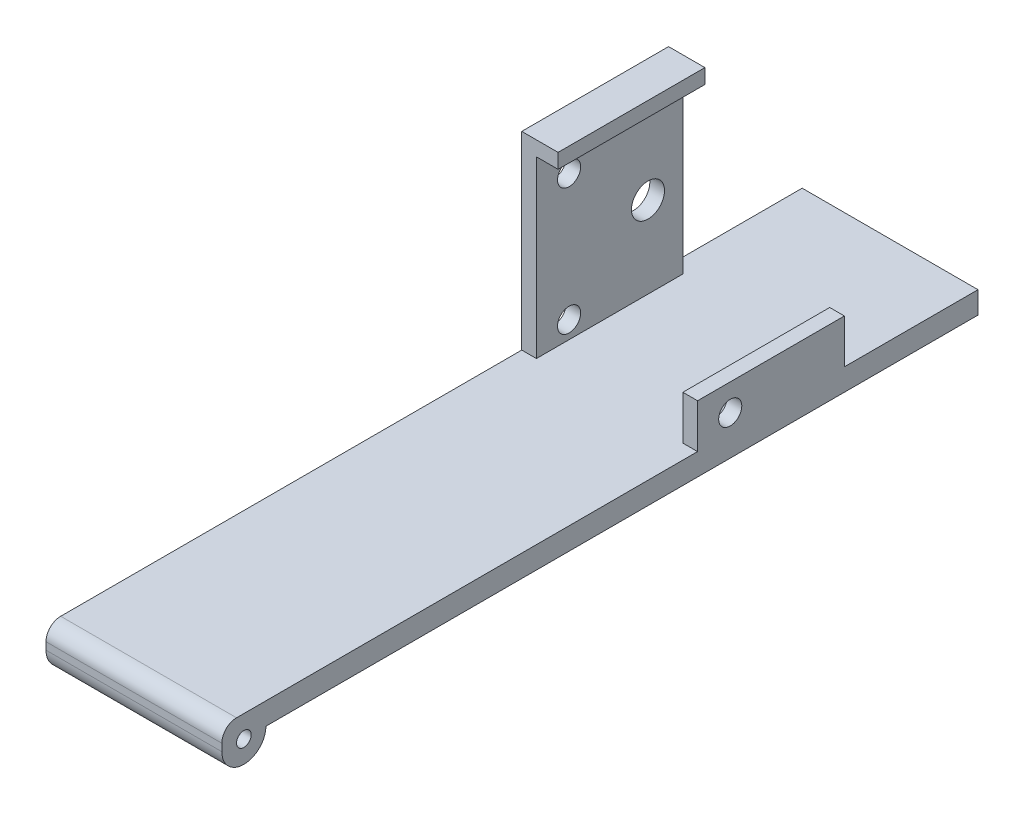
ISO-10303-21;
HEADER;
FILE_DESCRIPTION(('STEP AP214'),'2;1');
FILE_NAME('part.step','',(''),(''),'','','');
FILE_SCHEMA(('AUTOMOTIVE_DESIGN { 1 0 10303 214 1 1 1 1 }'));
ENDSEC;
DATA;
#1=APPLICATION_CONTEXT('core data for automotive mechanical design processes');
#2=APPLICATION_PROTOCOL_DEFINITION('international standard','automotive_design',2000,#1);
#3=PRODUCT_CONTEXT('',#1,'mechanical');
#4=PRODUCT('Part','Part','',(#3));
#5=PRODUCT_RELATED_PRODUCT_CATEGORY('part','',(#4));
#6=PRODUCT_DEFINITION_FORMATION('','',#4);
#7=PRODUCT_DEFINITION_CONTEXT('part definition',#1,'design');
#8=PRODUCT_DEFINITION('design','',#6,#7);
#9=PRODUCT_DEFINITION_SHAPE('','',#8);
#10=(LENGTH_UNIT() NAMED_UNIT(*) SI_UNIT(.MILLI.,.METRE.));
#11=(NAMED_UNIT(*) PLANE_ANGLE_UNIT() SI_UNIT($,.RADIAN.));
#12=(NAMED_UNIT(*) SI_UNIT($,.STERADIAN.) SOLID_ANGLE_UNIT());
#13=UNCERTAINTY_MEASURE_WITH_UNIT(LENGTH_MEASURE(1.E-05),#10,'distance_accuracy_value','');
#14=(GEOMETRIC_REPRESENTATION_CONTEXT(3) GLOBAL_UNCERTAINTY_ASSIGNED_CONTEXT((#13)) GLOBAL_UNIT_ASSIGNED_CONTEXT((#10,
#11,#12)) REPRESENTATION_CONTEXT('',''));
#15=CARTESIAN_POINT('',(0.,0.,0.));
#16=DIRECTION('',(0.,0.,1.));
#17=DIRECTION('',(1.,0.,0.));
#18=AXIS2_PLACEMENT_3D('',#15,#16,#17);
#19=CARTESIAN_POINT('',(9.975,25.7330481366075,-3.56846330647235));
#20=DIRECTION('',(0.,0.,-1.));
#21=DIRECTION('',(0.,1.,0.));
#22=AXIS2_PLACEMENT_3D('',#19,#20,#21);
#23=PLANE('',#22);
#24=DIRECTION('',(1.,0.,0.));
#25=VECTOR('',#24,1.);
#26=CARTESIAN_POINT('',(-7.025,7.93304813660745,-3.56846330647235));
#27=LINE('',#26,#25);
#28=CARTESIAN_POINT('',(9.975,7.93304813660745,-3.56846330647235));
#29=VERTEX_POINT('',#28);
#30=CARTESIAN_POINT('',(11.975,7.93304813660745,-3.56846330647235));
#31=VERTEX_POINT('',#30);
#32=EDGE_CURVE('E48',#29,#31,#27,.T.);
#33=ORIENTED_EDGE('',*,*,#32,.T.);
#34=DIRECTION('',(0.,1.,0.));
#35=VECTOR('',#34,1.);
#36=CARTESIAN_POINT('',(11.975,25.7330481366075,-3.56846330647235));
#37=LINE('',#36,#35);
#38=CARTESIAN_POINT('',(11.975,1.93304813660745,-3.56846330647235));
#39=VERTEX_POINT('',#38);
#40=EDGE_CURVE('E226',#39,#31,#37,.T.);
#41=ORIENTED_EDGE('',*,*,#40,.F.);
#42=DIRECTION('',(1.,0.,0.));
#43=VECTOR('',#42,1.);
#44=CARTESIAN_POINT('',(9.975,1.93304813660745,-3.56846330647235));
#45=LINE('',#44,#43);
#46=CARTESIAN_POINT('',(9.975,1.93304813660745,-3.56846330647235));
#47=VERTEX_POINT('',#46);
#48=EDGE_CURVE('E236',#47,#39,#45,.T.);
#49=ORIENTED_EDGE('',*,*,#48,.F.);
#50=DIRECTION('',(0.,1.,0.));
#51=VECTOR('',#50,1.);
#52=CARTESIAN_POINT('',(9.975,25.7330481366075,-3.56846330647235));
#53=LINE('',#52,#51);
#54=EDGE_CURVE('E229',#47,#29,#53,.T.);
#55=ORIENTED_EDGE('',*,*,#54,.T.);
#56=EDGE_LOOP('',(#33,#41,#49,#55));
#57=FACE_BOUND('',#56,.T.);
#58=ADVANCED_FACE('F33',(#57),#23,.T.);
#59=CARTESIAN_POINT('',(9.975,25.7330481366075,16.4315366935277));
#60=DIRECTION('',(0.,0.,1.));
#61=DIRECTION('',(1.,0.,0.));
#62=AXIS2_PLACEMENT_3D('',#59,#60,#61);
#63=PLANE('',#62);
#64=DIRECTION('',(1.,0.,0.));
#65=VECTOR('',#64,1.);
#66=CARTESIAN_POINT('',(-7.025,7.93304813660745,16.4315366935276));
#67=LINE('',#66,#65);
#68=CARTESIAN_POINT('',(9.975,7.93304813660745,16.4315366935276));
#69=VERTEX_POINT('',#68);
#70=CARTESIAN_POINT('',(11.975,7.93304813660745,16.4315366935276));
#71=VERTEX_POINT('',#70);
#72=EDGE_CURVE('E150',#69,#71,#67,.T.);
#73=ORIENTED_EDGE('',*,*,#72,.F.);
#74=DIRECTION('',(0.,-1.,0.));
#75=VECTOR('',#74,1.);
#76=CARTESIAN_POINT('',(9.975,25.7330481366075,16.4315366935277));
#77=LINE('',#76,#75);
#78=CARTESIAN_POINT('',(9.975,1.93304813660745,16.4315366935277));
#79=VERTEX_POINT('',#78);
#80=EDGE_CURVE('E223',#69,#79,#77,.T.);
#81=ORIENTED_EDGE('',*,*,#80,.T.);
#82=DIRECTION('',(1.,0.,0.));
#83=VECTOR('',#82,1.);
#84=CARTESIAN_POINT('',(9.975,1.93304813660745,16.4315366935277));
#85=LINE('',#84,#83);
#86=CARTESIAN_POINT('',(11.975,1.93304813660745,16.4315366935276));
#87=VERTEX_POINT('',#86);
#88=EDGE_CURVE('E232',#79,#87,#85,.T.);
#89=ORIENTED_EDGE('',*,*,#88,.T.);
#90=DIRECTION('',(0.,-1.,0.));
#91=VECTOR('',#90,1.);
#92=CARTESIAN_POINT('',(11.975,25.7330481366075,16.4315366935277));
#93=LINE('',#92,#91);
#94=EDGE_CURVE('E220',#71,#87,#93,.T.);
#95=ORIENTED_EDGE('',*,*,#94,.F.);
#96=EDGE_LOOP('',(#73,#81,#89,#95));
#97=FACE_BOUND('',#96,.T.);
#98=ADVANCED_FACE('F336',(#97),#63,.T.);
#99=CARTESIAN_POINT('',(11.975,1.93304813660745,-21.7682226541538));
#100=DIRECTION('',(0.,-1.,0.));
#101=DIRECTION('',(0.,0.,-1.));
#102=AXIS2_PLACEMENT_3D('',#99,#100,#101);
#103=PLANE('',#102);
#104=DIRECTION('',(-1.,0.,0.));
#105=VECTOR('',#104,1.);
#106=CARTESIAN_POINT('',(-9.975,1.93304813660745,16.4315366935277));
#107=LINE('',#106,#105);
#108=CARTESIAN_POINT('',(-9.975,1.93304813660745,16.4315366935276));
#109=VERTEX_POINT('',#108);
#110=CARTESIAN_POINT('',(-11.975,1.93304813660745,16.4315366935276));
#111=VERTEX_POINT('',#110);
#112=EDGE_CURVE('E212',#109,#111,#107,.T.);
#113=ORIENTED_EDGE('',*,*,#112,.T.);
#114=DIRECTION('',(0.,0.,1.));
#115=VECTOR('',#114,1.);
#116=CARTESIAN_POINT('',(-11.975,1.93304813660745,-21.7682226541538));
#117=LINE('',#116,#115);
#118=CARTESIAN_POINT('',(-11.975,1.93304813660744,79.2317773458462));
#119=VERTEX_POINT('',#118);
#120=EDGE_CURVE('E267',#111,#119,#117,.T.);
#121=ORIENTED_EDGE('',*,*,#120,.T.);
#122=DIRECTION('',(-1.,0.,0.));
#123=VECTOR('',#122,1.);
#124=CARTESIAN_POINT('',(11.975,1.93304813660744,79.2317773458462));
#125=LINE('',#124,#123);
#126=CARTESIAN_POINT('',(11.975,1.93304813660744,79.2317773458462));
#127=VERTEX_POINT('',#126);
#128=EDGE_CURVE('E288',#127,#119,#125,.T.);
#129=ORIENTED_EDGE('',*,*,#128,.F.);
#130=DIRECTION('',(0.,0.,1.));
#131=VECTOR('',#130,1.);
#132=CARTESIAN_POINT('',(11.975,1.93304813660745,-21.7682226541538));
#133=LINE('',#132,#131);
#134=EDGE_CURVE('E251',#87,#127,#133,.T.);
#135=ORIENTED_EDGE('',*,*,#134,.F.);
#136=ORIENTED_EDGE('',*,*,#88,.F.);
#137=DIRECTION('',(0.,0.,-1.));
#138=VECTOR('',#137,1.);
#139=CARTESIAN_POINT('',(9.975,1.93304813660745,16.4315366935277));
#140=LINE('',#139,#138);
#141=EDGE_CURVE('E225',#79,#47,#140,.T.);
#142=ORIENTED_EDGE('',*,*,#141,.T.);
#143=ORIENTED_EDGE('',*,*,#48,.T.);
#144=CARTESIAN_POINT('',(11.975,1.93304813660745,-21.7682226541538));
#145=VERTEX_POINT('',#144);
#146=EDGE_CURVE('E253',#145,#39,#133,.T.);
#147=ORIENTED_EDGE('',*,*,#146,.F.);
#148=DIRECTION('',(-1.,0.,0.));
#149=VECTOR('',#148,1.);
#150=CARTESIAN_POINT('',(11.975,1.93304813660745,-21.7682226541538));
#151=LINE('',#150,#149);
#152=CARTESIAN_POINT('',(-11.975,1.93304813660745,-21.7682226541538));
#153=VERTEX_POINT('',#152);
#154=EDGE_CURVE('E41',#145,#153,#151,.T.);
#155=ORIENTED_EDGE('',*,*,#154,.T.);
#156=CARTESIAN_POINT('',(-11.975,1.93304813660745,-3.56846330647235));
#157=VERTEX_POINT('',#156);
#158=EDGE_CURVE('E268',#153,#157,#117,.T.);
#159=ORIENTED_EDGE('',*,*,#158,.T.);
#160=DIRECTION('',(-1.,0.,0.));
#161=VECTOR('',#160,1.);
#162=CARTESIAN_POINT('',(-9.975,1.93304813660745,-3.56846330647235));
#163=LINE('',#162,#161);
#164=CARTESIAN_POINT('',(-9.975,1.93304813660745,-3.56846330647235));
#165=VERTEX_POINT('',#164);
#166=EDGE_CURVE('E208',#165,#157,#163,.T.);
#167=ORIENTED_EDGE('',*,*,#166,.F.);
#168=DIRECTION('',(0.,0.,-1.));
#169=VECTOR('',#168,1.);
#170=CARTESIAN_POINT('',(-9.975,1.93304813660745,16.4315366935277));
#171=LINE('',#170,#169);
#172=EDGE_CURVE('E202',#109,#165,#171,.T.);
#173=ORIENTED_EDGE('',*,*,#172,.F.);
#174=EDGE_LOOP('',(#113,#121,#129,#135,#136,#142,#143,#147,#155,#159,#167,#173));
#175=FACE_BOUND('',#174,.T.);
#176=ADVANCED_FACE('F293',(#175),#103,.F.);
#177=CARTESIAN_POINT('',(11.975,-1.06695186339256,78.2317773458462));
#178=DIRECTION('',(1.,0.,0.));
#179=DIRECTION('',(0.,0.,-1.));
#180=AXIS2_PLACEMENT_3D('',#177,#178,#179);
#181=PLANE('',#180);
#182=DIRECTION('',(0.,0.,-1.));
#183=VECTOR('',#182,1.);
#184=CARTESIAN_POINT('',(11.975,7.93304813660745,16.4315366935276));
#185=LINE('',#184,#183);
#186=EDGE_CURVE('E161',#71,#31,#185,.T.);
#187=ORIENTED_EDGE('',*,*,#186,.F.);
#188=ORIENTED_EDGE('',*,*,#94,.T.);
#189=ORIENTED_EDGE('',*,*,#134,.T.);
#190=CARTESIAN_POINT('',(11.975,-0.0669518633925606,79.2317773458462));
#191=DIRECTION('',(1.,0.,0.));
#192=DIRECTION('',(0.,0.,-1.));
#193=AXIS2_PLACEMENT_3D('',#190,#191,#192);
#194=CIRCLE('',#193,2.);
#195=CARTESIAN_POINT('',(11.975,-0.0669518633925603,81.2317773458462));
#196=VERTEX_POINT('',#195);
#197=EDGE_CURVE('E256',#127,#196,#194,.T.);
#198=ORIENTED_EDGE('',*,*,#197,.T.);
#199=DIRECTION('',(0.,-1.,0.));
#200=VECTOR('',#199,1.);
#201=CARTESIAN_POINT('',(11.975,-0.0669518633925608,81.2317773458462));
#202=LINE('',#201,#200);
#203=CARTESIAN_POINT('',(11.975,-1.06695186339256,81.2317773458462));
#204=VERTEX_POINT('',#203);
#205=EDGE_CURVE('E258',#196,#204,#202,.T.);
#206=ORIENTED_EDGE('',*,*,#205,.T.);
#207=CARTESIAN_POINT('',(11.975,-1.06695186339256,78.2317773458462));
#208=DIRECTION('',(1.,0.,0.));
#209=DIRECTION('',(0.,0.,-1.));
#210=AXIS2_PLACEMENT_3D('',#207,#208,#209);
#211=CIRCLE('',#210,3.);
#212=CARTESIAN_POINT('',(11.975,-1.06695186339256,75.2317773458462));
#213=VERTEX_POINT('',#212);
#214=EDGE_CURVE('E260',#204,#213,#211,.T.);
#215=ORIENTED_EDGE('',*,*,#214,.T.);
#216=DIRECTION('',(0.,0.,-1.));
#217=VECTOR('',#216,1.);
#218=CARTESIAN_POINT('',(11.975,-1.06695186339255,-21.7682226541538));
#219=LINE('',#218,#217);
#220=CARTESIAN_POINT('',(11.975,-1.06695186339255,-21.7682226541538));
#221=VERTEX_POINT('',#220);
#222=EDGE_CURVE('E262',#213,#221,#219,.T.);
#223=ORIENTED_EDGE('',*,*,#222,.T.);
#224=DIRECTION('',(0.,1.,0.));
#225=VECTOR('',#224,1.);
#226=CARTESIAN_POINT('',(11.975,1.93304813660745,-21.7682226541538));
#227=LINE('',#226,#225);
#228=EDGE_CURVE('E248',#221,#145,#227,.T.);
#229=ORIENTED_EDGE('',*,*,#228,.T.);
#230=ORIENTED_EDGE('',*,*,#146,.T.);
#231=ORIENTED_EDGE('',*,*,#40,.T.);
#232=EDGE_LOOP('',(#187,#188,#189,#198,#206,#215,#223,#229,#230,#231));
#233=FACE_BOUND('',#232,.T.);
#234=CARTESIAN_POINT('',(11.975,-1.06695186339256,78.2317773458462));
#235=DIRECTION('',(1.,0.,0.));
#236=DIRECTION('',(0.,0.,-1.));
#237=AXIS2_PLACEMENT_3D('',#234,#235,#236);
#238=CIRCLE('',#237,0.999999999999998);
#239=CARTESIAN_POINT('',(11.975,-1.06695186339256,77.2317773458462));
#240=VERTEX_POINT('',#239);
#241=EDGE_CURVE('E242',#240,#240,#238,.T.);
#242=ORIENTED_EDGE('',*,*,#241,.F.);
#243=EDGE_LOOP('',(#242));
#244=FACE_BOUND('',#243,.T.);
#245=CARTESIAN_POINT('',(11.975,4.30804813660745,11.9815366935276));
#246=DIRECTION('',(1.,0.,0.));
#247=DIRECTION('',(0.,0.,-1.));
#248=AXIS2_PLACEMENT_3D('',#245,#246,#247);
#249=CIRCLE('',#248,1.57500000000001);
#250=CARTESIAN_POINT('',(11.975,4.30804813660745,10.4065366935276));
#251=VERTEX_POINT('',#250);
#252=EDGE_CURVE('E214',#251,#251,#249,.T.);
#253=ORIENTED_EDGE('',*,*,#252,.F.);
#254=EDGE_LOOP('',(#253));
#255=FACE_BOUND('',#254,.T.);
#256=ADVANCED_FACE('F327',(#233,#244,#255),#181,.T.);
#257=CARTESIAN_POINT('',(-11.975,-1.06695186339256,78.2317773458462));
#258=DIRECTION('',(1.,0.,0.));
#259=DIRECTION('',(0.,0.,-1.));
#260=AXIS2_PLACEMENT_3D('',#257,#258,#259);
#261=PLANE('',#260);
#262=DIRECTION('',(0.,1.,0.));
#263=VECTOR('',#262,1.);
#264=CARTESIAN_POINT('',(-11.975,1.93304813660745,-21.7682226541538));
#265=LINE('',#264,#263);
#266=CARTESIAN_POINT('',(-11.975,-1.06695186339255,-21.7682226541538));
#267=VERTEX_POINT('',#266);
#268=EDGE_CURVE('E245',#267,#153,#265,.T.);
#269=ORIENTED_EDGE('',*,*,#268,.F.);
#270=DIRECTION('',(0.,0.,-1.));
#271=VECTOR('',#270,1.);
#272=CARTESIAN_POINT('',(-11.975,-1.06695186339255,-21.7682226541538));
#273=LINE('',#272,#271);
#274=CARTESIAN_POINT('',(-11.975,-1.06695186339256,75.2317773458462));
#275=VERTEX_POINT('',#274);
#276=EDGE_CURVE('E252',#275,#267,#273,.T.);
#277=ORIENTED_EDGE('',*,*,#276,.F.);
#278=CARTESIAN_POINT('',(-11.975,-1.06695186339256,78.2317773458462));
#279=DIRECTION('',(1.,0.,0.));
#280=DIRECTION('',(0.,0.,-1.));
#281=AXIS2_PLACEMENT_3D('',#278,#279,#280);
#282=CIRCLE('',#281,3.);
#283=CARTESIAN_POINT('',(-11.975,-1.06695186339256,81.2317773458462));
#284=VERTEX_POINT('',#283);
#285=EDGE_CURVE('E274',#284,#275,#282,.T.);
#286=ORIENTED_EDGE('',*,*,#285,.F.);
#287=DIRECTION('',(0.,-1.,0.));
#288=VECTOR('',#287,1.);
#289=CARTESIAN_POINT('',(-11.975,-0.0669518633925608,81.2317773458462));
#290=LINE('',#289,#288);
#291=CARTESIAN_POINT('',(-11.975,-0.0669518633925603,81.2317773458462));
#292=VERTEX_POINT('',#291);
#293=EDGE_CURVE('E272',#292,#284,#290,.T.);
#294=ORIENTED_EDGE('',*,*,#293,.F.);
#295=CARTESIAN_POINT('',(-11.975,-0.0669518633925606,79.2317773458462));
#296=DIRECTION('',(1.,0.,0.));
#297=DIRECTION('',(0.,0.,-1.));
#298=AXIS2_PLACEMENT_3D('',#295,#296,#297);
#299=CIRCLE('',#298,2.);
#300=EDGE_CURVE('E270',#119,#292,#299,.T.);
#301=ORIENTED_EDGE('',*,*,#300,.F.);
#302=ORIENTED_EDGE('',*,*,#120,.F.);
#303=DIRECTION('',(0.,-1.,0.));
#304=VECTOR('',#303,1.);
#305=CARTESIAN_POINT('',(-11.975,25.7330481366075,16.4315366935277));
#306=LINE('',#305,#304);
#307=CARTESIAN_POINT('',(-11.975,27.7330481366075,16.4315366935276));
#308=VERTEX_POINT('',#307);
#309=EDGE_CURVE('E199',#308,#111,#306,.T.);
#310=ORIENTED_EDGE('',*,*,#309,.F.);
#311=DIRECTION('',(0.,0.,1.));
#312=VECTOR('',#311,1.);
#313=CARTESIAN_POINT('',(-11.975,27.7330481366075,-3.56846330647235));
#314=LINE('',#313,#312);
#315=CARTESIAN_POINT('',(-11.975,27.7330481366075,-3.56846330647235));
#316=VERTEX_POINT('',#315);
#317=EDGE_CURVE('E165',#316,#308,#314,.T.);
#318=ORIENTED_EDGE('',*,*,#317,.F.);
#319=DIRECTION('',(0.,1.,0.));
#320=VECTOR('',#319,1.);
#321=CARTESIAN_POINT('',(-11.975,25.7330481366075,-3.56846330647235));
#322=LINE('',#321,#320);
#323=EDGE_CURVE('E192',#157,#316,#322,.T.);
#324=ORIENTED_EDGE('',*,*,#323,.F.);
#325=ORIENTED_EDGE('',*,*,#158,.F.);
#326=EDGE_LOOP('',(#269,#277,#286,#294,#301,#302,#310,#318,#324,#325));
#327=FACE_BOUND('',#326,.T.);
#328=CARTESIAN_POINT('',(-11.975,-1.06695186339256,78.2317773458462));
#329=DIRECTION('',(1.,0.,0.));
#330=DIRECTION('',(0.,0.,-1.));
#331=AXIS2_PLACEMENT_3D('',#328,#329,#330);
#332=CIRCLE('',#331,0.999999999999998);
#333=CARTESIAN_POINT('',(-11.975,-1.06695186339256,77.2317773458462));
#334=VERTEX_POINT('',#333);
#335=EDGE_CURVE('E239',#334,#334,#332,.T.);
#336=ORIENTED_EDGE('',*,*,#335,.T.);
#337=EDGE_LOOP('',(#336));
#338=FACE_BOUND('',#337,.T.);
#339=CARTESIAN_POINT('',(-11.975,21.5580481366075,11.9815366935276));
#340=DIRECTION('',(1.,0.,0.));
#341=DIRECTION('',(0.,0.,-1.));
#342=AXIS2_PLACEMENT_3D('',#339,#340,#341);
#343=CIRCLE('',#342,1.575);
#344=CARTESIAN_POINT('',(-11.975,21.5580481366075,10.4065366935276));
#345=VERTEX_POINT('',#344);
#346=EDGE_CURVE('E180',#345,#345,#343,.T.);
#347=ORIENTED_EDGE('',*,*,#346,.T.);
#348=EDGE_LOOP('',(#347));
#349=FACE_BOUND('',#348,.T.);
#350=CARTESIAN_POINT('',(-11.975,4.30804813660745,11.9815366935276));
#351=DIRECTION('',(1.,0.,0.));
#352=DIRECTION('',(0.,0.,-1.));
#353=AXIS2_PLACEMENT_3D('',#350,#351,#352);
#354=CIRCLE('',#353,1.57500000000001);
#355=CARTESIAN_POINT('',(-11.975,4.30804813660745,10.4065366935276));
#356=VERTEX_POINT('',#355);
#357=EDGE_CURVE('E186',#356,#356,#354,.T.);
#358=ORIENTED_EDGE('',*,*,#357,.T.);
#359=EDGE_LOOP('',(#358));
#360=FACE_BOUND('',#359,.T.);
#361=CARTESIAN_POINT('',(-11.975,13.0330481366075,1.23153669352761));
#362=DIRECTION('',(1.,0.,0.));
#363=DIRECTION('',(0.,0.,-1.));
#364=AXIS2_PLACEMENT_3D('',#361,#362,#363);
#365=CIRCLE('',#364,2.25);
#366=CARTESIAN_POINT('',(-11.975,13.0330481366075,-1.01846330647239));
#367=VERTEX_POINT('',#366);
#368=EDGE_CURVE('E168',#367,#367,#365,.T.);
#369=ORIENTED_EDGE('',*,*,#368,.T.);
#370=EDGE_LOOP('',(#369));
#371=FACE_BOUND('',#370,.T.);
#372=ADVANCED_FACE('F300',(#327,#338,#349,#360,#371),#261,.F.);
#373=CARTESIAN_POINT('',(11.975,1.93304813660745,-21.7682226541538));
#374=DIRECTION('',(0.,0.,1.));
#375=DIRECTION('',(1.,0.,0.));
#376=AXIS2_PLACEMENT_3D('',#373,#374,#375);
#377=PLANE('',#376);
#378=ORIENTED_EDGE('',*,*,#268,.T.);
#379=ORIENTED_EDGE('',*,*,#154,.F.);
#380=ORIENTED_EDGE('',*,*,#228,.F.);
#381=DIRECTION('',(-1.,0.,0.));
#382=VECTOR('',#381,1.);
#383=CARTESIAN_POINT('',(11.975,-1.06695186339255,-21.7682226541538));
#384=LINE('',#383,#382);
#385=EDGE_CURVE('E264',#221,#267,#384,.T.);
#386=ORIENTED_EDGE('',*,*,#385,.T.);
#387=EDGE_LOOP('',(#378,#379,#380,#386));
#388=FACE_BOUND('',#387,.T.);
#389=ADVANCED_FACE('F35',(#388),#377,.F.);
#390=CARTESIAN_POINT('',(11.975,-0.0669518633925606,79.2317773458462));
#391=DIRECTION('',(-1.,0.,0.));
#392=DIRECTION('',(0.,0.,1.));
#393=AXIS2_PLACEMENT_3D('',#390,#391,#392);
#394=CYLINDRICAL_SURFACE('',#393,2.);
#395=ORIENTED_EDGE('',*,*,#300,.T.);
#396=DIRECTION('',(-1.,0.,0.));
#397=VECTOR('',#396,1.);
#398=CARTESIAN_POINT('',(11.975,-0.0669518633925603,81.2317773458462));
#399=LINE('',#398,#397);
#400=EDGE_CURVE('E285',#196,#292,#399,.T.);
#401=ORIENTED_EDGE('',*,*,#400,.F.);
#402=ORIENTED_EDGE('',*,*,#197,.F.);
#403=ORIENTED_EDGE('',*,*,#128,.T.);
#404=EDGE_LOOP('',(#395,#401,#402,#403));
#405=FACE_BOUND('',#404,.T.);
#406=ADVANCED_FACE('F318',(#405),#394,.T.);
#407=CARTESIAN_POINT('',(11.975,-0.0669518633925608,81.2317773458462));
#408=DIRECTION('',(0.,0.,-1.));
#409=DIRECTION('',(-1.,0.,0.));
#410=AXIS2_PLACEMENT_3D('',#407,#408,#409);
#411=PLANE('',#410);
#412=ORIENTED_EDGE('',*,*,#293,.T.);
#413=DIRECTION('',(-1.,0.,0.));
#414=VECTOR('',#413,1.);
#415=CARTESIAN_POINT('',(11.975,-1.06695186339256,81.2317773458462));
#416=LINE('',#415,#414);
#417=EDGE_CURVE('E282',#204,#284,#416,.T.);
#418=ORIENTED_EDGE('',*,*,#417,.F.);
#419=ORIENTED_EDGE('',*,*,#205,.F.);
#420=ORIENTED_EDGE('',*,*,#400,.T.);
#421=EDGE_LOOP('',(#412,#418,#419,#420));
#422=FACE_BOUND('',#421,.T.);
#423=ADVANCED_FACE('F322',(#422),#411,.F.);
#424=CARTESIAN_POINT('',(11.975,-1.06695186339256,78.2317773458462));
#425=DIRECTION('',(-1.,0.,0.));
#426=DIRECTION('',(0.,0.,1.));
#427=AXIS2_PLACEMENT_3D('',#424,#425,#426);
#428=CYLINDRICAL_SURFACE('',#427,3.);
#429=ORIENTED_EDGE('',*,*,#285,.T.);
#430=DIRECTION('',(-1.,0.,0.));
#431=VECTOR('',#430,1.);
#432=CARTESIAN_POINT('',(11.975,-1.06695186339256,75.2317773458462));
#433=LINE('',#432,#431);
#434=EDGE_CURVE('E279',#213,#275,#433,.T.);
#435=ORIENTED_EDGE('',*,*,#434,.F.);
#436=ORIENTED_EDGE('',*,*,#214,.F.);
#437=ORIENTED_EDGE('',*,*,#417,.T.);
#438=EDGE_LOOP('',(#429,#435,#436,#437));
#439=FACE_BOUND('',#438,.T.);
#440=ADVANCED_FACE('F346',(#439),#428,.T.);
#441=CARTESIAN_POINT('',(11.975,-1.06695186339255,-21.7682226541538));
#442=DIRECTION('',(0.,1.,0.));
#443=DIRECTION('',(0.,0.,1.));
#444=AXIS2_PLACEMENT_3D('',#441,#442,#443);
#445=PLANE('',#444);
#446=ORIENTED_EDGE('',*,*,#276,.T.);
#447=ORIENTED_EDGE('',*,*,#385,.F.);
#448=ORIENTED_EDGE('',*,*,#222,.F.);
#449=ORIENTED_EDGE('',*,*,#434,.T.);
#450=EDGE_LOOP('',(#446,#447,#448,#449));
#451=FACE_BOUND('',#450,.T.);
#452=ADVANCED_FACE('F344',(#451),#445,.F.);
#453=CARTESIAN_POINT('',(11.975,-1.06695186339256,78.2317773458462));
#454=DIRECTION('',(-1.,0.,0.));
#455=DIRECTION('',(0.,0.,1.));
#456=AXIS2_PLACEMENT_3D('',#453,#454,#455);
#457=CYLINDRICAL_SURFACE('',#456,0.999999999999998);
#458=ORIENTED_EDGE('',*,*,#241,.T.);
#459=EDGE_LOOP('',(#458));
#460=FACE_BOUND('',#459,.T.);
#461=ORIENTED_EDGE('',*,*,#335,.F.);
#462=EDGE_LOOP('',(#461));
#463=FACE_BOUND('',#462,.T.);
#464=ADVANCED_FACE('F353',(#460,#463),#457,.F.);
#465=DIRECTION('',(0.,1.,0.));
#466=VECTOR('',#465,1.);
#467=CARTESIAN_POINT('',(-7.025,7.93304813660745,-3.56846330647235));
#468=LINE('',#467,#466);
#469=CARTESIAN_POINT('',(-7.025,25.7330481366075,-3.56846330647235));
#470=VERTEX_POINT('',#469);
#471=CARTESIAN_POINT('',(-7.025,27.7330481366075,-3.56846330647235));
#472=VERTEX_POINT('',#471);
#473=EDGE_CURVE('E55',#470,#472,#468,.T.);
#474=ORIENTED_EDGE('',*,*,#473,.F.);
#475=DIRECTION('',(-1.,0.,0.));
#476=VECTOR('',#475,1.);
#477=CARTESIAN_POINT('',(-11.975,25.7330481366075,-3.56846330647235));
#478=LINE('',#477,#476);
#479=CARTESIAN_POINT('',(-9.975,25.7330481366075,-3.56846330647235));
#480=VERTEX_POINT('',#479);
#481=EDGE_CURVE('E170',#470,#480,#478,.T.);
#482=ORIENTED_EDGE('',*,*,#481,.T.);
#483=DIRECTION('',(0.,1.,0.));
#484=VECTOR('',#483,1.);
#485=CARTESIAN_POINT('',(-9.975,25.7330481366075,-3.56846330647235));
#486=LINE('',#485,#484);
#487=EDGE_CURVE('E198',#165,#480,#486,.T.);
#488=ORIENTED_EDGE('',*,*,#487,.F.);
#489=ORIENTED_EDGE('',*,*,#166,.T.);
#490=ORIENTED_EDGE('',*,*,#323,.T.);
#491=DIRECTION('',(-1.,0.,0.));
#492=VECTOR('',#491,1.);
#493=CARTESIAN_POINT('',(-11.975,27.7330481366075,-3.56846330647235));
#494=LINE('',#493,#492);
#495=EDGE_CURVE('E166',#472,#316,#494,.T.);
#496=ORIENTED_EDGE('',*,*,#495,.F.);
#497=EDGE_LOOP('',(#474,#482,#488,#489,#490,#496));
#498=FACE_BOUND('',#497,.T.);
#499=ADVANCED_FACE('F305',(#498),#23,.T.);
#500=DIRECTION('',(0.,-1.,0.));
#501=VECTOR('',#500,1.);
#502=CARTESIAN_POINT('',(-7.025,7.93304813660745,16.4315366935276));
#503=LINE('',#502,#501);
#504=CARTESIAN_POINT('',(-7.025,27.7330481366075,16.4315366935276));
#505=VERTEX_POINT('',#504);
#506=CARTESIAN_POINT('',(-7.025,25.7330481366075,16.4315366935276));
#507=VERTEX_POINT('',#506);
#508=EDGE_CURVE('E145',#505,#507,#503,.T.);
#509=ORIENTED_EDGE('',*,*,#508,.F.);
#510=DIRECTION('',(1.,0.,0.));
#511=VECTOR('',#510,1.);
#512=CARTESIAN_POINT('',(-11.975,27.7330481366075,16.4315366935276));
#513=LINE('',#512,#511);
#514=EDGE_CURVE('E157',#308,#505,#513,.T.);
#515=ORIENTED_EDGE('',*,*,#514,.F.);
#516=ORIENTED_EDGE('',*,*,#309,.T.);
#517=ORIENTED_EDGE('',*,*,#112,.F.);
#518=DIRECTION('',(0.,-1.,0.));
#519=VECTOR('',#518,1.);
#520=CARTESIAN_POINT('',(-9.975,25.7330481366075,16.4315366935277));
#521=LINE('',#520,#519);
#522=CARTESIAN_POINT('',(-9.975,25.7330481366075,16.4315366935277));
#523=VERTEX_POINT('',#522);
#524=EDGE_CURVE('E205',#523,#109,#521,.T.);
#525=ORIENTED_EDGE('',*,*,#524,.F.);
#526=DIRECTION('',(1.,0.,0.));
#527=VECTOR('',#526,1.);
#528=CARTESIAN_POINT('',(-11.975,25.7330481366075,16.4315366935276));
#529=LINE('',#528,#527);
#530=EDGE_CURVE('E160',#523,#507,#529,.T.);
#531=ORIENTED_EDGE('',*,*,#530,.T.);
#532=EDGE_LOOP('',(#509,#515,#516,#517,#525,#531));
#533=FACE_BOUND('',#532,.T.);
#534=ADVANCED_FACE('F155',(#533),#63,.T.);
#535=CARTESIAN_POINT('',(9.975,0.,0.));
#536=DIRECTION('',(1.,0.,0.));
#537=DIRECTION('',(0.,0.,-1.));
#538=AXIS2_PLACEMENT_3D('',#535,#536,#537);
#539=PLANE('',#538);
#540=CARTESIAN_POINT('',(9.975,4.30804813660745,11.9815366935276));
#541=DIRECTION('',(1.,0.,0.));
#542=DIRECTION('',(0.,0.,-1.));
#543=AXIS2_PLACEMENT_3D('',#540,#541,#542);
#544=CIRCLE('',#543,1.57500000000001);
#545=CARTESIAN_POINT('',(9.975,4.30804813660745,10.4065366935276));
#546=VERTEX_POINT('',#545);
#547=EDGE_CURVE('E217',#546,#546,#544,.T.);
#548=ORIENTED_EDGE('',*,*,#547,.T.);
#549=EDGE_LOOP('',(#548));
#550=FACE_BOUND('',#549,.T.);
#551=ORIENTED_EDGE('',*,*,#80,.F.);
#552=DIRECTION('',(0.,0.,-1.));
#553=VECTOR('',#552,1.);
#554=CARTESIAN_POINT('',(9.975,7.93304813660745,0.));
#555=LINE('',#554,#553);
#556=EDGE_CURVE('E11',#69,#29,#555,.T.);
#557=ORIENTED_EDGE('',*,*,#556,.T.);
#558=ORIENTED_EDGE('',*,*,#54,.F.);
#559=ORIENTED_EDGE('',*,*,#141,.F.);
#560=EDGE_LOOP('',(#551,#557,#558,#559));
#561=FACE_BOUND('',#560,.T.);
#562=ADVANCED_FACE('F340',(#550,#561),#539,.F.);
#563=CARTESIAN_POINT('',(9.975,4.30804813660745,11.9815366935276));
#564=DIRECTION('',(1.,0.,0.));
#565=DIRECTION('',(0.,0.,-1.));
#566=AXIS2_PLACEMENT_3D('',#563,#564,#565);
#567=CYLINDRICAL_SURFACE('',#566,1.57500000000001);
#568=ORIENTED_EDGE('',*,*,#547,.F.);
#569=EDGE_LOOP('',(#568));
#570=FACE_BOUND('',#569,.T.);
#571=ORIENTED_EDGE('',*,*,#252,.T.);
#572=EDGE_LOOP('',(#571));
#573=FACE_BOUND('',#572,.T.);
#574=ADVANCED_FACE('F423',(#570,#573),#567,.F.);
#575=CARTESIAN_POINT('',(-9.975,0.,0.));
#576=DIRECTION('',(-1.,0.,0.));
#577=DIRECTION('',(0.,0.,-1.));
#578=AXIS2_PLACEMENT_3D('',#575,#576,#577);
#579=PLANE('',#578);
#580=DIRECTION('',(0.,0.,1.));
#581=VECTOR('',#580,1.);
#582=CARTESIAN_POINT('',(-9.975,25.7330481366075,-3.56846330647235));
#583=LINE('',#582,#581);
#584=EDGE_CURVE('E195',#480,#523,#583,.T.);
#585=ORIENTED_EDGE('',*,*,#584,.T.);
#586=ORIENTED_EDGE('',*,*,#524,.T.);
#587=ORIENTED_EDGE('',*,*,#172,.T.);
#588=ORIENTED_EDGE('',*,*,#487,.T.);
#589=EDGE_LOOP('',(#585,#586,#587,#588));
#590=FACE_BOUND('',#589,.T.);
#591=CARTESIAN_POINT('',(-9.975,4.30804813660745,11.9815366935276));
#592=DIRECTION('',(1.,0.,0.));
#593=DIRECTION('',(0.,0.,-1.));
#594=AXIS2_PLACEMENT_3D('',#591,#592,#593);
#595=CIRCLE('',#594,1.57500000000001);
#596=CARTESIAN_POINT('',(-9.975,4.30804813660745,10.4065366935276));
#597=VERTEX_POINT('',#596);
#598=EDGE_CURVE('E189',#597,#597,#595,.T.);
#599=ORIENTED_EDGE('',*,*,#598,.F.);
#600=EDGE_LOOP('',(#599));
#601=FACE_BOUND('',#600,.T.);
#602=CARTESIAN_POINT('',(-9.975,21.5580481366075,11.9815366935276));
#603=DIRECTION('',(1.,0.,0.));
#604=DIRECTION('',(0.,0.,-1.));
#605=AXIS2_PLACEMENT_3D('',#602,#603,#604);
#606=CIRCLE('',#605,1.575);
#607=CARTESIAN_POINT('',(-9.975,21.5580481366075,10.4065366935276));
#608=VERTEX_POINT('',#607);
#609=EDGE_CURVE('E183',#608,#608,#606,.T.);
#610=ORIENTED_EDGE('',*,*,#609,.F.);
#611=EDGE_LOOP('',(#610));
#612=FACE_BOUND('',#611,.T.);
#613=CARTESIAN_POINT('',(-9.975,13.0330481366075,1.23153669352761));
#614=DIRECTION('',(1.,0.,0.));
#615=DIRECTION('',(0.,0.,-1.));
#616=AXIS2_PLACEMENT_3D('',#613,#614,#615);
#617=CIRCLE('',#616,2.25);
#618=CARTESIAN_POINT('',(-9.975,13.0330481366075,-1.01846330647239));
#619=VERTEX_POINT('',#618);
#620=EDGE_CURVE('E177',#619,#619,#617,.T.);
#621=ORIENTED_EDGE('',*,*,#620,.F.);
#622=EDGE_LOOP('',(#621));
#623=FACE_BOUND('',#622,.T.);
#624=ADVANCED_FACE('F308',(#590,#601,#612,#623),#579,.F.);
#625=CARTESIAN_POINT('',(-9.975,4.30804813660745,11.9815366935276));
#626=DIRECTION('',(-1.,0.,0.));
#627=DIRECTION('',(0.,0.,1.));
#628=AXIS2_PLACEMENT_3D('',#625,#626,#627);
#629=CYLINDRICAL_SURFACE('',#628,1.57500000000001);
#630=ORIENTED_EDGE('',*,*,#598,.T.);
#631=EDGE_LOOP('',(#630));
#632=FACE_BOUND('',#631,.T.);
#633=ORIENTED_EDGE('',*,*,#357,.F.);
#634=EDGE_LOOP('',(#633));
#635=FACE_BOUND('',#634,.T.);
#636=ADVANCED_FACE('F474',(#632,#635),#629,.F.);
#637=CARTESIAN_POINT('',(-9.975,21.5580481366075,11.9815366935276));
#638=DIRECTION('',(-1.,0.,0.));
#639=DIRECTION('',(0.,0.,1.));
#640=AXIS2_PLACEMENT_3D('',#637,#638,#639);
#641=CYLINDRICAL_SURFACE('',#640,1.575);
#642=ORIENTED_EDGE('',*,*,#609,.T.);
#643=EDGE_LOOP('',(#642));
#644=FACE_BOUND('',#643,.T.);
#645=ORIENTED_EDGE('',*,*,#346,.F.);
#646=EDGE_LOOP('',(#645));
#647=FACE_BOUND('',#646,.T.);
#648=ADVANCED_FACE('F470',(#644,#647),#641,.F.);
#649=CARTESIAN_POINT('',(-9.975,13.0330481366075,1.23153669352761));
#650=DIRECTION('',(-1.,0.,0.));
#651=DIRECTION('',(0.,0.,1.));
#652=AXIS2_PLACEMENT_3D('',#649,#650,#651);
#653=CYLINDRICAL_SURFACE('',#652,2.25);
#654=ORIENTED_EDGE('',*,*,#620,.T.);
#655=EDGE_LOOP('',(#654));
#656=FACE_BOUND('',#655,.T.);
#657=ORIENTED_EDGE('',*,*,#368,.F.);
#658=EDGE_LOOP('',(#657));
#659=FACE_BOUND('',#658,.T.);
#660=ADVANCED_FACE('F435',(#656,#659),#653,.F.);
#661=CARTESIAN_POINT('',(0.,25.7330481366075,0.));
#662=DIRECTION('',(0.,1.,0.));
#663=DIRECTION('',(0.,0.,1.));
#664=AXIS2_PLACEMENT_3D('',#661,#662,#663);
#665=PLANE('',#664);
#666=ORIENTED_EDGE('',*,*,#481,.F.);
#667=DIRECTION('',(0.,0.,1.));
#668=VECTOR('',#667,1.);
#669=CARTESIAN_POINT('',(-7.025,25.7330481366075,0.));
#670=LINE('',#669,#668);
#671=EDGE_CURVE('E175',#470,#507,#670,.T.);
#672=ORIENTED_EDGE('',*,*,#671,.T.);
#673=ORIENTED_EDGE('',*,*,#530,.F.);
#674=ORIENTED_EDGE('',*,*,#584,.F.);
#675=EDGE_LOOP('',(#666,#672,#673,#674));
#676=FACE_BOUND('',#675,.T.);
#677=ADVANCED_FACE('F431',(#676),#665,.F.);
#678=CARTESIAN_POINT('',(0.,27.7330481366075,0.));
#679=DIRECTION('',(0.,1.,0.));
#680=DIRECTION('',(0.,0.,1.));
#681=AXIS2_PLACEMENT_3D('',#678,#679,#680);
#682=PLANE('',#681);
#683=DIRECTION('',(0.,0.,1.));
#684=VECTOR('',#683,1.);
#685=CARTESIAN_POINT('',(-7.025,27.7330481366075,16.4315366935276));
#686=LINE('',#685,#684);
#687=EDGE_CURVE('E142',#472,#505,#686,.T.);
#688=ORIENTED_EDGE('',*,*,#687,.F.);
#689=ORIENTED_EDGE('',*,*,#495,.T.);
#690=ORIENTED_EDGE('',*,*,#317,.T.);
#691=ORIENTED_EDGE('',*,*,#514,.T.);
#692=EDGE_LOOP('',(#688,#689,#690,#691));
#693=FACE_BOUND('',#692,.T.);
#694=ADVANCED_FACE('F163',(#693),#682,.T.);
#695=CARTESIAN_POINT('',(-7.025,0.,0.));
#696=DIRECTION('',(-1.,0.,0.));
#697=DIRECTION('',(0.,0.,1.));
#698=AXIS2_PLACEMENT_3D('',#695,#696,#697);
#699=PLANE('',#698);
#700=ORIENTED_EDGE('',*,*,#473,.T.);
#701=ORIENTED_EDGE('',*,*,#687,.T.);
#702=ORIENTED_EDGE('',*,*,#508,.T.);
#703=ORIENTED_EDGE('',*,*,#671,.F.);
#704=EDGE_LOOP('',(#700,#701,#702,#703));
#705=FACE_BOUND('',#704,.T.);
#706=ADVANCED_FACE('F144',(#705),#699,.F.);
#707=CARTESIAN_POINT('',(-7.025,7.93304813660745,16.4315366935276));
#708=DIRECTION('',(0.,-1.,0.));
#709=DIRECTION('',(0.,0.,-1.));
#710=AXIS2_PLACEMENT_3D('',#707,#708,#709);
#711=PLANE('',#710);
#712=ORIENTED_EDGE('',*,*,#72,.T.);
#713=ORIENTED_EDGE('',*,*,#186,.T.);
#714=ORIENTED_EDGE('',*,*,#32,.F.);
#715=ORIENTED_EDGE('',*,*,#556,.F.);
#716=EDGE_LOOP('',(#712,#713,#714,#715));
#717=FACE_BOUND('',#716,.T.);
#718=ADVANCED_FACE('F455',(#717),#711,.F.);
#719=CLOSED_SHELL('',(#58,#98,#176,#256,#372,#389,#406,#423,#440,#452,#464,#499,#534,#562,#574,
#624,#636,#648,#660,#677,#694,#706,#718));
#720=MANIFOLD_SOLID_BREP('B2',#719);
#721=ADVANCED_BREP_SHAPE_REPRESENTATION('',(#18,#720),#14);
#722=SHAPE_DEFINITION_REPRESENTATION(#9,#721);
ENDSEC;
END-ISO-10303-21;
